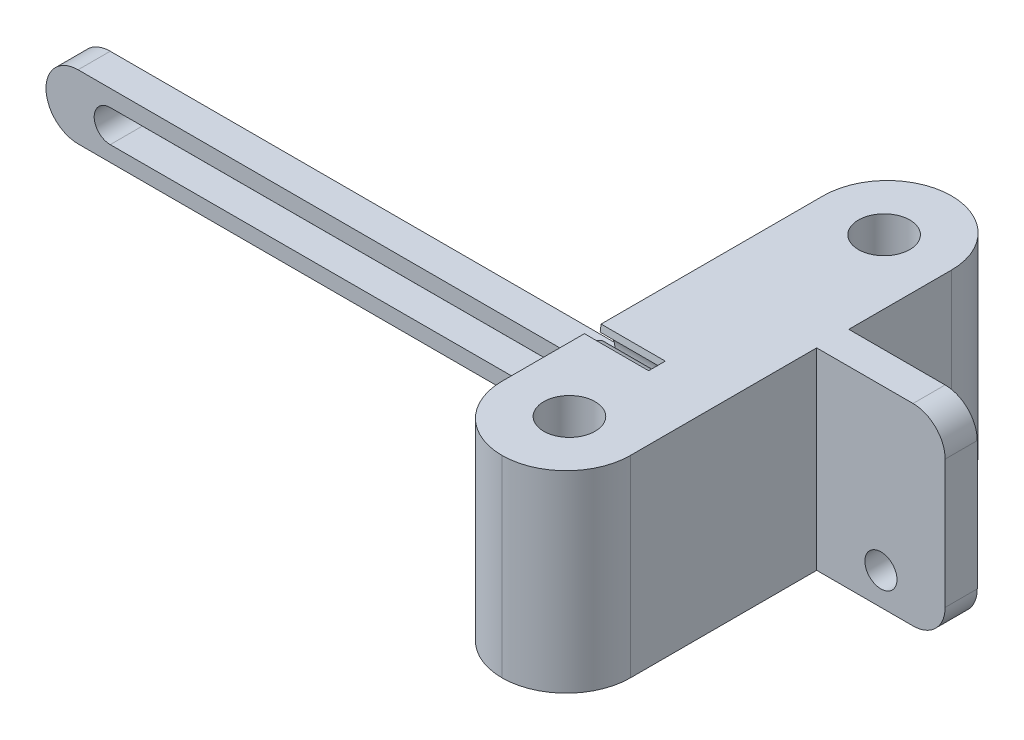
ISO-10303-21;
HEADER;
FILE_DESCRIPTION(('STEP AP214'),'2;1');
FILE_NAME('part.step','',(''),(''),'','','');
FILE_SCHEMA(('AUTOMOTIVE_DESIGN { 1 0 10303 214 1 1 1 1 }'));
ENDSEC;
DATA;
#1=APPLICATION_CONTEXT('core data for automotive mechanical design processes');
#2=APPLICATION_PROTOCOL_DEFINITION('international standard','automotive_design',2000,#1);
#3=PRODUCT_CONTEXT('',#1,'mechanical');
#4=PRODUCT('Part','Part','',(#3));
#5=PRODUCT_RELATED_PRODUCT_CATEGORY('part','',(#4));
#6=PRODUCT_DEFINITION_FORMATION('','',#4);
#7=PRODUCT_DEFINITION_CONTEXT('part definition',#1,'design');
#8=PRODUCT_DEFINITION('design','',#6,#7);
#9=PRODUCT_DEFINITION_SHAPE('','',#8);
#10=(LENGTH_UNIT() NAMED_UNIT(*) SI_UNIT(.MILLI.,.METRE.));
#11=(NAMED_UNIT(*) PLANE_ANGLE_UNIT() SI_UNIT($,.RADIAN.));
#12=(NAMED_UNIT(*) SI_UNIT($,.STERADIAN.) SOLID_ANGLE_UNIT());
#13=UNCERTAINTY_MEASURE_WITH_UNIT(LENGTH_MEASURE(1.E-05),#10,'distance_accuracy_value','');
#14=(GEOMETRIC_REPRESENTATION_CONTEXT(3) GLOBAL_UNCERTAINTY_ASSIGNED_CONTEXT((#13)) GLOBAL_UNIT_ASSIGNED_CONTEXT((#10,
#11,#12)) REPRESENTATION_CONTEXT('',''));
#15=CARTESIAN_POINT('',(0.,0.,0.));
#16=DIRECTION('',(0.,0.,1.));
#17=DIRECTION('',(1.,0.,0.));
#18=AXIS2_PLACEMENT_3D('',#15,#16,#17);
#19=CARTESIAN_POINT('',(0.,0.,0.));
#20=DIRECTION('',(0.,1.,0.));
#21=DIRECTION('',(0.,0.,1.));
#22=AXIS2_PLACEMENT_3D('',#19,#20,#21);
#23=PLANE('',#22);
#24=DIRECTION('',(-1.,0.,0.));
#25=VECTOR('',#24,1.);
#26=CARTESIAN_POINT('',(36.4776119402985,0.,-3.76119402985075));
#27=LINE('',#26,#25);
#28=CARTESIAN_POINT('',(31.4776119402985,0.,-3.76119402985075));
#29=VERTEX_POINT('',#28);
#30=CARTESIAN_POINT('',(-98.5223880597015,0.,-3.76119402985073));
#31=VERTEX_POINT('',#30);
#32=EDGE_CURVE('E326',#29,#31,#27,.T.);
#33=ORIENTED_EDGE('',*,*,#32,.F.);
#34=DIRECTION('',(0.,0.,1.));
#35=VECTOR('',#34,1.);
#36=CARTESIAN_POINT('',(31.4776119402985,0.,0.));
#37=LINE('',#36,#35);
#38=CARTESIAN_POINT('',(31.4776119402985,0.,1.23880597014925));
#39=VERTEX_POINT('',#38);
#40=EDGE_CURVE('E305',#29,#39,#37,.T.);
#41=ORIENTED_EDGE('',*,*,#40,.T.);
#42=DIRECTION('',(-1.,0.,0.));
#43=VECTOR('',#42,1.);
#44=CARTESIAN_POINT('',(36.4776119402985,0.,1.23880597014925));
#45=LINE('',#44,#43);
#46=CARTESIAN_POINT('',(16.4776119402985,0.,1.23880597014926));
#47=VERTEX_POINT('',#46);
#48=EDGE_CURVE('E325',#39,#47,#45,.T.);
#49=ORIENTED_EDGE('',*,*,#48,.T.);
#50=DIRECTION('',(0.,0.,-1.));
#51=VECTOR('',#50,1.);
#52=CARTESIAN_POINT('',(16.4776119402985,0.,-29.7611940298508));
#53=LINE('',#52,#51);
#54=CARTESIAN_POINT('',(16.4776119402985,0.,30.2388059701493));
#55=VERTEX_POINT('',#54);
#56=EDGE_CURVE('E241',#55,#47,#53,.T.);
#57=ORIENTED_EDGE('',*,*,#56,.F.);
#58=CARTESIAN_POINT('',(6.47761194029854,0.,30.2388059701493));
#59=DIRECTION('',(0.,1.,0.));
#60=DIRECTION('',(0.,0.,1.));
#61=AXIS2_PLACEMENT_3D('',#58,#59,#60);
#62=CIRCLE('',#61,10.);
#63=CARTESIAN_POINT('',(6.47761194029854,0.,40.2388059701493));
#64=VERTEX_POINT('',#63);
#65=EDGE_CURVE('E259',#55,#64,#62,.F.);
#66=ORIENTED_EDGE('',*,*,#65,.T.);
#67=CARTESIAN_POINT('',(6.47761194029854,0.,30.2388059701493));
#68=DIRECTION('',(0.,1.,0.));
#69=DIRECTION('',(0.,0.,1.));
#70=AXIS2_PLACEMENT_3D('',#67,#68,#69);
#71=CIRCLE('',#70,10.);
#72=CARTESIAN_POINT('',(-3.52238805970146,0.,30.2388059701493));
#73=VERTEX_POINT('',#72);
#74=EDGE_CURVE('E256',#64,#73,#71,.F.);
#75=ORIENTED_EDGE('',*,*,#74,.T.);
#76=DIRECTION('',(0.,0.,1.));
#77=VECTOR('',#76,1.);
#78=CARTESIAN_POINT('',(-3.52238805970147,0.,-29.7611940298508));
#79=LINE('',#78,#77);
#80=CARTESIAN_POINT('',(-3.52238805970147,0.,1.23880597014926));
#81=VERTEX_POINT('',#80);
#82=EDGE_CURVE('E246',#81,#73,#79,.T.);
#83=ORIENTED_EDGE('',*,*,#82,.F.);
#84=CARTESIAN_POINT('',(-98.5223880597015,0.,1.23880597014927));
#85=VERTEX_POINT('',#84);
#86=EDGE_CURVE('E318',#81,#85,#45,.T.);
#87=ORIENTED_EDGE('',*,*,#86,.T.);
#88=DIRECTION('',(0.,0.,1.));
#89=VECTOR('',#88,1.);
#90=CARTESIAN_POINT('',(-98.5223880597015,0.,-3.76119402985073));
#91=LINE('',#90,#89);
#92=EDGE_CURVE('E303',#85,#31,#91,.F.);
#93=ORIENTED_EDGE('',*,*,#92,.T.);
#94=EDGE_LOOP('',(#33,#41,#49,#57,#66,#75,#83,#87,#93));
#95=FACE_BOUND('',#94,.T.);
#96=ADVANCED_FACE('F33',(#95),#23,.F.);
#97=CARTESIAN_POINT('',(16.4776119402985,30.,-29.7611940298508));
#98=DIRECTION('',(-1.,0.,0.));
#99=DIRECTION('',(0.,0.,1.));
#100=AXIS2_PLACEMENT_3D('',#97,#98,#99);
#101=PLANE('',#100);
#102=DIRECTION('',(0.,-1.,0.));
#103=VECTOR('',#102,1.);
#104=CARTESIAN_POINT('',(16.4776119402985,30.,-3.76119402985075));
#105=LINE('',#104,#103);
#106=CARTESIAN_POINT('',(16.4776119402985,30.,-3.76119402985075));
#107=VERTEX_POINT('',#106);
#108=CARTESIAN_POINT('',(16.4776119402985,10.,-3.76119402985075));
#109=VERTEX_POINT('',#108);
#110=EDGE_CURVE('E285',#107,#109,#105,.T.);
#111=ORIENTED_EDGE('',*,*,#110,.T.);
#112=DIRECTION('',(0.,0.,1.));
#113=VECTOR('',#112,1.);
#114=CARTESIAN_POINT('',(16.4776119402985,10.,-3.76119402985075));
#115=LINE('',#114,#113);
#116=CARTESIAN_POINT('',(16.4776119402985,10.,-9.76119402985075));
#117=VERTEX_POINT('',#116);
#118=EDGE_CURVE('E226',#117,#109,#115,.T.);
#119=ORIENTED_EDGE('',*,*,#118,.F.);
#120=DIRECTION('',(0.,1.,0.));
#121=VECTOR('',#120,1.);
#122=CARTESIAN_POINT('',(16.4776119402985,10.,-9.76119402985075));
#123=LINE('',#122,#121);
#124=CARTESIAN_POINT('',(16.4776119402985,0.,-9.76119402985075));
#125=VERTEX_POINT('',#124);
#126=EDGE_CURVE('E217',#125,#117,#123,.T.);
#127=ORIENTED_EDGE('',*,*,#126,.F.);
#128=CARTESIAN_POINT('',(16.4776119402985,0.,-19.7611940298507));
#129=VERTEX_POINT('',#128);
#130=EDGE_CURVE('E232',#125,#129,#53,.T.);
#131=ORIENTED_EDGE('',*,*,#130,.T.);
#132=DIRECTION('',(0.,-1.,0.));
#133=VECTOR('',#132,1.);
#134=CARTESIAN_POINT('',(16.4776119402985,30.,-19.7611940298507));
#135=LINE('',#134,#133);
#136=CARTESIAN_POINT('',(16.4776119402985,30.,-19.7611940298507));
#137=VERTEX_POINT('',#136);
#138=EDGE_CURVE('E275',#129,#137,#135,.F.);
#139=ORIENTED_EDGE('',*,*,#138,.T.);
#140=DIRECTION('',(0.,0.,-1.));
#141=VECTOR('',#140,1.);
#142=CARTESIAN_POINT('',(16.4776119402985,30.,-29.7611940298508));
#143=LINE('',#142,#141);
#144=EDGE_CURVE('E401',#107,#137,#143,.T.);
#145=ORIENTED_EDGE('',*,*,#144,.F.);
#146=EDGE_LOOP('',(#111,#119,#127,#131,#139,#145));
#147=FACE_BOUND('',#146,.T.);
#148=ADVANCED_FACE('F230',(#147),#101,.F.);
#149=CARTESIAN_POINT('',(-3.52238805970147,30.,-29.7611940298508));
#150=DIRECTION('',(1.,0.,0.));
#151=DIRECTION('',(0.,0.,-1.));
#152=AXIS2_PLACEMENT_3D('',#149,#150,#151);
#153=PLANE('',#152);
#154=DIRECTION('',(0.,-1.,0.));
#155=VECTOR('',#154,1.);
#156=CARTESIAN_POINT('',(-3.52238805970147,10.,-9.76119402985075));
#157=LINE('',#156,#155);
#158=CARTESIAN_POINT('',(-3.52238805970147,10.,-9.76119402985075));
#159=VERTEX_POINT('',#158);
#160=CARTESIAN_POINT('',(-3.52238805970147,0.,-9.76119402985075));
#161=VERTEX_POINT('',#160);
#162=EDGE_CURVE('E220',#159,#161,#157,.T.);
#163=ORIENTED_EDGE('',*,*,#162,.F.);
#164=DIRECTION('',(0.,0.,-1.));
#165=VECTOR('',#164,1.);
#166=CARTESIAN_POINT('',(-3.52238805970147,10.,-3.76119402985077));
#167=LINE('',#166,#165);
#168=CARTESIAN_POINT('',(-3.52238805970147,10.,-3.76119402985075));
#169=VERTEX_POINT('',#168);
#170=EDGE_CURVE('E235',#169,#159,#167,.T.);
#171=ORIENTED_EDGE('',*,*,#170,.F.);
#172=DIRECTION('',(0.,0.,-1.));
#173=VECTOR('',#172,1.);
#174=CARTESIAN_POINT('',(-3.52238805970145,10.,1.23880597014925));
#175=LINE('',#174,#173);
#176=CARTESIAN_POINT('',(-3.52238805970145,10.,1.23880597014925));
#177=VERTEX_POINT('',#176);
#178=EDGE_CURVE('E499',#177,#169,#175,.T.);
#179=ORIENTED_EDGE('',*,*,#178,.F.);
#180=DIRECTION('',(0.,-1.,0.));
#181=VECTOR('',#180,1.);
#182=CARTESIAN_POINT('',(-3.52238805970146,30.,1.23880597014926));
#183=LINE('',#182,#181);
#184=CARTESIAN_POINT('',(-3.52238805970146,7.49509615086032,1.23880597014926));
#185=VERTEX_POINT('',#184);
#186=EDGE_CURVE('E352',#177,#185,#183,.T.);
#187=ORIENTED_EDGE('',*,*,#186,.T.);
#188=CARTESIAN_POINT('',(-3.52238805970148,2.49509374490727,1.23880597014925));
#189=VERTEX_POINT('',#188);
#190=EDGE_CURVE('E351',#185,#189,#183,.T.);
#191=ORIENTED_EDGE('',*,*,#190,.T.);
#192=EDGE_CURVE('E348',#189,#81,#183,.T.);
#193=ORIENTED_EDGE('',*,*,#192,.T.);
#194=ORIENTED_EDGE('',*,*,#82,.T.);
#195=DIRECTION('',(0.,-1.,0.));
#196=VECTOR('',#195,1.);
#197=CARTESIAN_POINT('',(-3.52238805970146,30.,30.2388059701493));
#198=LINE('',#197,#196);
#199=CARTESIAN_POINT('',(-3.52238805970146,30.,30.2388059701493));
#200=VERTEX_POINT('',#199);
#201=EDGE_CURVE('E250',#73,#200,#198,.F.);
#202=ORIENTED_EDGE('',*,*,#201,.T.);
#203=DIRECTION('',(0.,0.,1.));
#204=VECTOR('',#203,1.);
#205=CARTESIAN_POINT('',(-3.52238805970147,30.,-29.7611940298508));
#206=LINE('',#205,#204);
#207=CARTESIAN_POINT('',(-3.52238805970146,30.,17.4075983617578));
#208=VERTEX_POINT('',#207);
#209=EDGE_CURVE('E245',#208,#200,#206,.T.);
#210=ORIENTED_EDGE('',*,*,#209,.F.);
#211=DIRECTION('',(0.,-0.998274373174996,-0.0587220219514735));
#212=VECTOR('',#211,1.);
#213=CARTESIAN_POINT('',(-3.52238805970146,-0.916997145344465,15.5889514708551));
#214=LINE('',#213,#212);
#215=CARTESIAN_POINT('',(-3.52238805970146,28.9802150072761,17.3476110092446));
#216=VERTEX_POINT('',#215);
#217=EDGE_CURVE('E374',#208,#216,#214,.T.);
#218=ORIENTED_EDGE('',*,*,#217,.T.);
#219=CARTESIAN_POINT('',(-3.52238805970146,25.6865831727299,16.1635547021105));
#220=DIRECTION('',(-1.,0.,0.));
#221=DIRECTION('',(0.,0.,1.));
#222=AXIS2_PLACEMENT_3D('',#219,#220,#221);
#223=CIRCLE('',#222,3.5);
#224=CARTESIAN_POINT('',(-3.52238805970146,28.9694464253818,14.9499613334784));
#225=VERTEX_POINT('',#224);
#226=EDGE_CURVE('E371',#225,#216,#223,.T.);
#227=ORIENTED_EDGE('',*,*,#226,.F.);
#228=DIRECTION('',(0.,0.991227900682634,-0.132163720091024));
#229=VECTOR('',#228,1.);
#230=CARTESIAN_POINT('',(-3.52238805970146,2.46452674980748,18.4839506235552));
#231=LINE('',#230,#229);
#232=CARTESIAN_POINT('',(-3.52238805970146,30.,14.812554190196));
#233=VERTEX_POINT('',#232);
#234=EDGE_CURVE('E281',#225,#233,#231,.T.);
#235=ORIENTED_EDGE('',*,*,#234,.T.);
#236=CARTESIAN_POINT('',(-3.52238805970147,30.,-19.7611940298507));
#237=VERTEX_POINT('',#236);
#238=EDGE_CURVE('E400',#237,#233,#206,.T.);
#239=ORIENTED_EDGE('',*,*,#238,.F.);
#240=DIRECTION('',(0.,-1.,0.));
#241=VECTOR('',#240,1.);
#242=CARTESIAN_POINT('',(-3.52238805970147,30.,-19.7611940298507));
#243=LINE('',#242,#241);
#244=CARTESIAN_POINT('',(-3.52238805970147,0.,-19.7611940298507));
#245=VERTEX_POINT('',#244);
#246=EDGE_CURVE('E252',#237,#245,#243,.T.);
#247=ORIENTED_EDGE('',*,*,#246,.T.);
#248=EDGE_CURVE('E242',#245,#161,#79,.T.);
#249=ORIENTED_EDGE('',*,*,#248,.T.);
#250=EDGE_LOOP('',(#163,#171,#179,#187,#191,#193,#194,#202,#210,#218,#227,#235,#239,#247,#249));
#251=FACE_BOUND('',#250,.T.);
#252=ADVANCED_FACE('F422',(#251),#153,.F.);
#253=CARTESIAN_POINT('',(0.,30.,0.));
#254=DIRECTION('',(0.,1.,0.));
#255=DIRECTION('',(0.,0.,1.));
#256=AXIS2_PLACEMENT_3D('',#253,#254,#255);
#257=PLANE('',#256);
#258=DIRECTION('',(-1.,0.,0.));
#259=VECTOR('',#258,1.);
#260=CARTESIAN_POINT('',(36.4776119402985,30.,1.23880597014925));
#261=LINE('',#260,#259);
#262=CARTESIAN_POINT('',(31.4776119402985,30.,1.23880597014925));
#263=VERTEX_POINT('',#262);
#264=CARTESIAN_POINT('',(16.4776119402985,30.,1.23880597014925));
#265=VERTEX_POINT('',#264);
#266=EDGE_CURVE('E456',#263,#265,#261,.T.);
#267=ORIENTED_EDGE('',*,*,#266,.F.);
#268=DIRECTION('',(0.,0.,-1.));
#269=VECTOR('',#268,1.);
#270=CARTESIAN_POINT('',(31.4776119402985,30.,-3.76119402985075));
#271=LINE('',#270,#269);
#272=CARTESIAN_POINT('',(31.4776119402985,30.,-3.76119402985075));
#273=VERTEX_POINT('',#272);
#274=EDGE_CURVE('E287',#263,#273,#271,.T.);
#275=ORIENTED_EDGE('',*,*,#274,.T.);
#276=DIRECTION('',(-1.,0.,0.));
#277=VECTOR('',#276,1.);
#278=CARTESIAN_POINT('',(36.4776119402985,30.,-3.76119402985075));
#279=LINE('',#278,#277);
#280=EDGE_CURVE('E349',#273,#107,#279,.T.);
#281=ORIENTED_EDGE('',*,*,#280,.T.);
#282=ORIENTED_EDGE('',*,*,#144,.T.);
#283=CARTESIAN_POINT('',(6.47761194029853,30.,-19.7611940298507));
#284=DIRECTION('',(0.,1.,0.));
#285=DIRECTION('',(0.,0.,1.));
#286=AXIS2_PLACEMENT_3D('',#283,#284,#285);
#287=CIRCLE('',#286,10.);
#288=CARTESIAN_POINT('',(6.47761194029853,30.,-29.7611940298508));
#289=VERTEX_POINT('',#288);
#290=EDGE_CURVE('E268',#137,#289,#287,.T.);
#291=ORIENTED_EDGE('',*,*,#290,.T.);
#292=CARTESIAN_POINT('',(6.47761194029853,30.,-19.7611940298507));
#293=DIRECTION('',(0.,1.,0.));
#294=DIRECTION('',(0.,0.,1.));
#295=AXIS2_PLACEMENT_3D('',#292,#293,#294);
#296=CIRCLE('',#295,10.);
#297=EDGE_CURVE('E270',#289,#237,#296,.T.);
#298=ORIENTED_EDGE('',*,*,#297,.T.);
#299=ORIENTED_EDGE('',*,*,#238,.T.);
#300=DIRECTION('',(-1.,0.,0.));
#301=VECTOR('',#300,1.);
#302=CARTESIAN_POINT('',(6.47761194029853,30.,14.812554190196));
#303=LINE('',#302,#301);
#304=CARTESIAN_POINT('',(6.47761194029853,30.,14.812554190196));
#305=VERTEX_POINT('',#304);
#306=EDGE_CURVE('E379',#305,#233,#303,.T.);
#307=ORIENTED_EDGE('',*,*,#306,.F.);
#308=DIRECTION('',(0.,0.,-1.));
#309=VECTOR('',#308,1.);
#310=CARTESIAN_POINT('',(6.47761194029853,30.,0.));
#311=LINE('',#310,#309);
#312=CARTESIAN_POINT('',(6.47761194029853,30.,17.4075983617578));
#313=VERTEX_POINT('',#312);
#314=EDGE_CURVE('E362',#313,#305,#311,.T.);
#315=ORIENTED_EDGE('',*,*,#314,.F.);
#316=DIRECTION('',(-1.,0.,0.));
#317=VECTOR('',#316,1.);
#318=CARTESIAN_POINT('',(6.47761194029853,30.,17.4075983617578));
#319=LINE('',#318,#317);
#320=EDGE_CURVE('E383',#313,#208,#319,.T.);
#321=ORIENTED_EDGE('',*,*,#320,.T.);
#322=ORIENTED_EDGE('',*,*,#209,.T.);
#323=CARTESIAN_POINT('',(6.47761194029854,30.,30.2388059701493));
#324=DIRECTION('',(0.,1.,0.));
#325=DIRECTION('',(0.,0.,1.));
#326=AXIS2_PLACEMENT_3D('',#323,#324,#325);
#327=CIRCLE('',#326,10.);
#328=CARTESIAN_POINT('',(6.47761194029854,30.,40.2388059701493));
#329=VERTEX_POINT('',#328);
#330=EDGE_CURVE('E264',#200,#329,#327,.T.);
#331=ORIENTED_EDGE('',*,*,#330,.T.);
#332=CARTESIAN_POINT('',(6.47761194029854,30.,30.2388059701493));
#333=DIRECTION('',(0.,1.,0.));
#334=DIRECTION('',(0.,0.,1.));
#335=AXIS2_PLACEMENT_3D('',#332,#333,#334);
#336=CIRCLE('',#335,10.);
#337=CARTESIAN_POINT('',(16.4776119402985,30.,30.2388059701493));
#338=VERTEX_POINT('',#337);
#339=EDGE_CURVE('E266',#329,#338,#336,.T.);
#340=ORIENTED_EDGE('',*,*,#339,.T.);
#341=EDGE_CURVE('E253',#338,#265,#143,.T.);
#342=ORIENTED_EDGE('',*,*,#341,.T.);
#343=EDGE_LOOP('',(#267,#275,#281,#282,#291,#298,#299,#307,#315,#321,#322,#331,#340,#342));
#344=FACE_BOUND('',#343,.T.);
#345=CARTESIAN_POINT('',(6.47761194029853,30.,29.7388059701493));
#346=DIRECTION('',(0.,1.,0.));
#347=DIRECTION('',(0.,0.,1.));
#348=AXIS2_PLACEMENT_3D('',#345,#346,#347);
#349=CIRCLE('',#348,4.);
#350=CARTESIAN_POINT('',(6.47761194029853,30.,33.7388059701493));
#351=VERTEX_POINT('',#350);
#352=EDGE_CURVE('E382',#351,#351,#349,.T.);
#353=ORIENTED_EDGE('',*,*,#352,.F.);
#354=EDGE_LOOP('',(#353));
#355=FACE_BOUND('',#354,.T.);
#356=CARTESIAN_POINT('',(6.47761194029853,30.,-19.2611940298507));
#357=DIRECTION('',(0.,1.,0.));
#358=DIRECTION('',(0.,0.,1.));
#359=AXIS2_PLACEMENT_3D('',#356,#357,#358);
#360=CIRCLE('',#359,4.);
#361=CARTESIAN_POINT('',(6.47761194029853,30.,-15.2611940298507));
#362=VERTEX_POINT('',#361);
#363=EDGE_CURVE('E392',#362,#362,#360,.T.);
#364=ORIENTED_EDGE('',*,*,#363,.F.);
#365=EDGE_LOOP('',(#364));
#366=FACE_BOUND('',#365,.T.);
#367=ADVANCED_FACE('F407',(#344,#355,#366),#257,.T.);
#368=ORIENTED_EDGE('',*,*,#56,.T.);
#369=DIRECTION('',(0.,1.,0.));
#370=VECTOR('',#369,1.);
#371=CARTESIAN_POINT('',(16.4776119402985,30.,1.23880597014925));
#372=LINE('',#371,#370);
#373=EDGE_CURVE('E345',#47,#265,#372,.T.);
#374=ORIENTED_EDGE('',*,*,#373,.T.);
#375=ORIENTED_EDGE('',*,*,#341,.F.);
#376=DIRECTION('',(0.,-1.,0.));
#377=VECTOR('',#376,1.);
#378=CARTESIAN_POINT('',(16.4776119402985,30.,30.2388059701493));
#379=LINE('',#378,#377);
#380=EDGE_CURVE('E272',#338,#55,#379,.T.);
#381=ORIENTED_EDGE('',*,*,#380,.T.);
#382=EDGE_LOOP('',(#368,#374,#375,#381));
#383=FACE_BOUND('',#382,.T.);
#384=ADVANCED_FACE('F450',(#383),#101,.F.);
#385=ORIENTED_EDGE('',*,*,#130,.F.);
#386=DIRECTION('',(1.,0.,0.));
#387=VECTOR('',#386,1.);
#388=CARTESIAN_POINT('',(-103.523388059701,0.,-9.76119402985075));
#389=LINE('',#388,#387);
#390=EDGE_CURVE('E214',#161,#125,#389,.T.);
#391=ORIENTED_EDGE('',*,*,#390,.F.);
#392=ORIENTED_EDGE('',*,*,#248,.F.);
#393=CARTESIAN_POINT('',(6.47761194029853,0.,-19.7611940298507));
#394=DIRECTION('',(0.,1.,0.));
#395=DIRECTION('',(0.,0.,1.));
#396=AXIS2_PLACEMENT_3D('',#393,#394,#395);
#397=CIRCLE('',#396,10.);
#398=CARTESIAN_POINT('',(6.47761194029853,0.,-29.7611940298508));
#399=VERTEX_POINT('',#398);
#400=EDGE_CURVE('E262',#245,#399,#397,.F.);
#401=ORIENTED_EDGE('',*,*,#400,.T.);
#402=CARTESIAN_POINT('',(6.47761194029853,0.,-19.7611940298507));
#403=DIRECTION('',(0.,1.,0.));
#404=DIRECTION('',(0.,0.,1.));
#405=AXIS2_PLACEMENT_3D('',#402,#403,#404);
#406=CIRCLE('',#405,10.);
#407=EDGE_CURVE('E239',#399,#129,#406,.F.);
#408=ORIENTED_EDGE('',*,*,#407,.T.);
#409=EDGE_LOOP('',(#385,#391,#392,#401,#408));
#410=FACE_BOUND('',#409,.T.);
#411=ADVANCED_FACE('F237',(#410),#23,.F.);
#412=CARTESIAN_POINT('',(6.47761194029853,10.,29.7388059701493));
#413=DIRECTION('',(0.,1.,0.));
#414=DIRECTION('',(0.,0.,1.));
#415=AXIS2_PLACEMENT_3D('',#412,#413,#414);
#416=CYLINDRICAL_SURFACE('',#415,4.);
#417=CARTESIAN_POINT('',(6.47761194029853,10.,29.7388059701493));
#418=DIRECTION('',(0.,1.,0.));
#419=DIRECTION('',(0.,0.,1.));
#420=AXIS2_PLACEMENT_3D('',#417,#418,#419);
#421=CIRCLE('',#420,4.);
#422=CARTESIAN_POINT('',(6.47761194029853,10.,33.7388059701493));
#423=VERTEX_POINT('',#422);
#424=EDGE_CURVE('E395',#423,#423,#421,.T.);
#425=ORIENTED_EDGE('',*,*,#424,.F.);
#426=EDGE_LOOP('',(#425));
#427=FACE_BOUND('',#426,.T.);
#428=ORIENTED_EDGE('',*,*,#352,.T.);
#429=EDGE_LOOP('',(#428));
#430=FACE_BOUND('',#429,.T.);
#431=ADVANCED_FACE('F555',(#427,#430),#416,.F.);
#432=CARTESIAN_POINT('',(6.47761194029853,10.,29.7388059701493));
#433=DIRECTION('',(0.,1.,0.));
#434=DIRECTION('',(0.,0.,1.));
#435=AXIS2_PLACEMENT_3D('',#432,#433,#434);
#436=PLANE('',#435);
#437=ORIENTED_EDGE('',*,*,#424,.T.);
#438=EDGE_LOOP('',(#437));
#439=FACE_BOUND('',#438,.T.);
#440=ADVANCED_FACE('F560',(#439),#436,.T.);
#441=CARTESIAN_POINT('',(6.47761194029853,10.,-19.2611940298507));
#442=DIRECTION('',(0.,1.,0.));
#443=DIRECTION('',(0.,0.,1.));
#444=AXIS2_PLACEMENT_3D('',#441,#442,#443);
#445=CYLINDRICAL_SURFACE('',#444,4.);
#446=CARTESIAN_POINT('',(6.47761194029853,10.,-19.2611940298507));
#447=DIRECTION('',(0.,1.,0.));
#448=DIRECTION('',(0.,0.,1.));
#449=AXIS2_PLACEMENT_3D('',#446,#447,#448);
#450=CIRCLE('',#449,4.);
#451=CARTESIAN_POINT('',(6.47761194029853,10.,-15.2611940298507));
#452=VERTEX_POINT('',#451);
#453=EDGE_CURVE('E389',#452,#452,#450,.T.);
#454=ORIENTED_EDGE('',*,*,#453,.F.);
#455=EDGE_LOOP('',(#454));
#456=FACE_BOUND('',#455,.T.);
#457=ORIENTED_EDGE('',*,*,#363,.T.);
#458=EDGE_LOOP('',(#457));
#459=FACE_BOUND('',#458,.T.);
#460=ADVANCED_FACE('F825',(#456,#459),#445,.F.);
#461=CARTESIAN_POINT('',(6.47761194029853,10.,-19.2611940298507));
#462=DIRECTION('',(0.,1.,0.));
#463=DIRECTION('',(0.,0.,1.));
#464=AXIS2_PLACEMENT_3D('',#461,#462,#463);
#465=PLANE('',#464);
#466=ORIENTED_EDGE('',*,*,#453,.T.);
#467=EDGE_LOOP('',(#466));
#468=FACE_BOUND('',#467,.T.);
#469=ADVANCED_FACE('F761',(#468),#465,.T.);
#470=CARTESIAN_POINT('',(6.47761194029853,2.46452674980748,18.4839506235552));
#471=DIRECTION('',(0.,0.132163720091024,0.991227900682634));
#472=DIRECTION('',(0.,-0.991227900682634,0.132163720091024));
#473=AXIS2_PLACEMENT_3D('',#470,#471,#472);
#474=PLANE('',#473);
#475=ORIENTED_EDGE('',*,*,#234,.F.);
#476=DIRECTION('',(-1.,0.,0.));
#477=VECTOR('',#476,1.);
#478=CARTESIAN_POINT('',(6.47761194029853,28.9694464253818,14.9499613334784));
#479=LINE('',#478,#477);
#480=CARTESIAN_POINT('',(6.47761194029853,28.9694464253818,14.9499613334784));
#481=VERTEX_POINT('',#480);
#482=EDGE_CURVE('E368',#481,#225,#479,.T.);
#483=ORIENTED_EDGE('',*,*,#482,.F.);
#484=DIRECTION('',(0.,0.991227900682634,-0.132163720091024));
#485=VECTOR('',#484,1.);
#486=CARTESIAN_POINT('',(6.47761194029853,2.46452674980748,18.4839506235552));
#487=LINE('',#486,#485);
#488=EDGE_CURVE('E354',#481,#305,#487,.T.);
#489=ORIENTED_EDGE('',*,*,#488,.T.);
#490=ORIENTED_EDGE('',*,*,#306,.T.);
#491=EDGE_LOOP('',(#475,#483,#489,#490));
#492=FACE_BOUND('',#491,.T.);
#493=ADVANCED_FACE('F426',(#492),#474,.T.);
#494=CARTESIAN_POINT('',(6.47761194029853,-0.916997145344465,15.5889514708551));
#495=DIRECTION('',(0.,0.0587220219514735,-0.998274373174996));
#496=DIRECTION('',(0.,0.998274373174996,0.0587220219514735));
#497=AXIS2_PLACEMENT_3D('',#494,#495,#496);
#498=PLANE('',#497);
#499=ORIENTED_EDGE('',*,*,#217,.F.);
#500=ORIENTED_EDGE('',*,*,#320,.F.);
#501=DIRECTION('',(0.,-0.998274373174996,-0.0587220219514735));
#502=VECTOR('',#501,1.);
#503=CARTESIAN_POINT('',(6.47761194029853,-0.916997145344465,15.5889514708551));
#504=LINE('',#503,#502);
#505=CARTESIAN_POINT('',(6.47761194029853,28.9802150072761,17.3476110092446));
#506=VERTEX_POINT('',#505);
#507=EDGE_CURVE('E360',#313,#506,#504,.T.);
#508=ORIENTED_EDGE('',*,*,#507,.T.);
#509=DIRECTION('',(-1.,0.,0.));
#510=VECTOR('',#509,1.);
#511=CARTESIAN_POINT('',(6.47761194029853,28.9802150072761,17.3476110092446));
#512=LINE('',#511,#510);
#513=EDGE_CURVE('E386',#506,#216,#512,.T.);
#514=ORIENTED_EDGE('',*,*,#513,.T.);
#515=EDGE_LOOP('',(#499,#500,#508,#514));
#516=FACE_BOUND('',#515,.T.);
#517=ADVANCED_FACE('F438',(#516),#498,.T.);
#518=CARTESIAN_POINT('',(6.47761194029853,25.6865831727299,16.1635547021105));
#519=DIRECTION('',(-1.,0.,0.));
#520=DIRECTION('',(0.,0.,1.));
#521=AXIS2_PLACEMENT_3D('',#518,#519,#520);
#522=CYLINDRICAL_SURFACE('',#521,3.5);
#523=ORIENTED_EDGE('',*,*,#226,.T.);
#524=ORIENTED_EDGE('',*,*,#513,.F.);
#525=CARTESIAN_POINT('',(6.47761194029853,25.6865831727299,16.1635547021105));
#526=DIRECTION('',(-1.,0.,0.));
#527=DIRECTION('',(0.,0.,1.));
#528=AXIS2_PLACEMENT_3D('',#525,#526,#527);
#529=CIRCLE('',#528,3.5);
#530=EDGE_CURVE('E356',#481,#506,#529,.T.);
#531=ORIENTED_EDGE('',*,*,#530,.F.);
#532=ORIENTED_EDGE('',*,*,#482,.T.);
#533=EDGE_LOOP('',(#523,#524,#531,#532));
#534=FACE_BOUND('',#533,.T.);
#535=ADVANCED_FACE('F770',(#534),#522,.F.);
#536=CARTESIAN_POINT('',(6.47761194029853,25.6865831727299,16.1635547021105));
#537=DIRECTION('',(-1.,0.,0.));
#538=DIRECTION('',(0.,0.,1.));
#539=AXIS2_PLACEMENT_3D('',#536,#537,#538);
#540=CYLINDRICAL_SURFACE('',#539,2.5);
#541=CARTESIAN_POINT('',(6.47761194029853,25.6865831727299,16.1635547021105));
#542=DIRECTION('',(-1.,0.,0.));
#543=DIRECTION('',(0.,0.,1.));
#544=AXIS2_PLACEMENT_3D('',#541,#542,#543);
#545=CIRCLE('',#544,2.5);
#546=CARTESIAN_POINT('',(6.47761194029853,25.6865831727299,18.6635547021105));
#547=VERTEX_POINT('',#546);
#548=EDGE_CURVE('E365',#547,#547,#545,.T.);
#549=ORIENTED_EDGE('',*,*,#548,.T.);
#550=EDGE_LOOP('',(#549));
#551=FACE_BOUND('',#550,.T.);
#552=CARTESIAN_POINT('',(-3.52238805970146,25.6865831727299,16.1635547021105));
#553=DIRECTION('',(-1.,0.,0.));
#554=DIRECTION('',(0.,0.,1.));
#555=AXIS2_PLACEMENT_3D('',#552,#553,#554);
#556=CIRCLE('',#555,2.5);
#557=CARTESIAN_POINT('',(-3.52238805970146,25.6865831727299,18.6635547021105));
#558=VERTEX_POINT('',#557);
#559=EDGE_CURVE('E357',#558,#558,#556,.T.);
#560=ORIENTED_EDGE('',*,*,#559,.F.);
#561=EDGE_LOOP('',(#560));
#562=FACE_BOUND('',#561,.T.);
#563=ADVANCED_FACE('F778',(#551,#562),#540,.T.);
#564=CARTESIAN_POINT('',(6.47761194029853,0.,0.));
#565=DIRECTION('',(-1.,0.,0.));
#566=DIRECTION('',(0.,0.,1.));
#567=AXIS2_PLACEMENT_3D('',#564,#565,#566);
#568=PLANE('',#567);
#569=ORIENTED_EDGE('',*,*,#488,.F.);
#570=ORIENTED_EDGE('',*,*,#530,.T.);
#571=ORIENTED_EDGE('',*,*,#507,.F.);
#572=ORIENTED_EDGE('',*,*,#314,.T.);
#573=EDGE_LOOP('',(#569,#570,#571,#572));
#574=FACE_BOUND('',#573,.T.);
#575=ORIENTED_EDGE('',*,*,#548,.F.);
#576=EDGE_LOOP('',(#575));
#577=FACE_BOUND('',#576,.T.);
#578=ADVANCED_FACE('F433',(#574,#577),#568,.T.);
#579=ORIENTED_EDGE('',*,*,#559,.T.);
#580=EDGE_LOOP('',(#579));
#581=FACE_BOUND('',#580,.T.);
#582=ADVANCED_FACE('F569',(#581),#153,.F.);
#583=CARTESIAN_POINT('',(6.47761194029853,30.,-19.7611940298507));
#584=DIRECTION('',(0.,-1.,0.));
#585=DIRECTION('',(0.,0.,-1.));
#586=AXIS2_PLACEMENT_3D('',#583,#584,#585);
#587=CYLINDRICAL_SURFACE('',#586,10.);
#588=DIRECTION('',(0.,-1.,0.));
#589=VECTOR('',#588,1.);
#590=CARTESIAN_POINT('',(6.47761194029853,30.,-29.7611940298508));
#591=LINE('',#590,#589);
#592=EDGE_CURVE('E278',#289,#399,#591,.T.);
#593=ORIENTED_EDGE('',*,*,#592,.F.);
#594=ORIENTED_EDGE('',*,*,#290,.F.);
#595=ORIENTED_EDGE('',*,*,#138,.F.);
#596=ORIENTED_EDGE('',*,*,#407,.F.);
#597=EDGE_LOOP('',(#593,#594,#595,#596));
#598=FACE_BOUND('',#597,.T.);
#599=ADVANCED_FACE('F414',(#598),#587,.T.);
#600=CARTESIAN_POINT('',(6.47761194029853,30.,-19.7611940298507));
#601=DIRECTION('',(0.,-1.,0.));
#602=DIRECTION('',(0.,0.,-1.));
#603=AXIS2_PLACEMENT_3D('',#600,#601,#602);
#604=CYLINDRICAL_SURFACE('',#603,10.);
#605=ORIENTED_EDGE('',*,*,#297,.F.);
#606=ORIENTED_EDGE('',*,*,#592,.T.);
#607=ORIENTED_EDGE('',*,*,#400,.F.);
#608=ORIENTED_EDGE('',*,*,#246,.F.);
#609=EDGE_LOOP('',(#605,#606,#607,#608));
#610=FACE_BOUND('',#609,.T.);
#611=ADVANCED_FACE('F418',(#610),#604,.T.);
#612=CARTESIAN_POINT('',(6.47761194029854,30.,30.2388059701493));
#613=DIRECTION('',(0.,-1.,0.));
#614=DIRECTION('',(0.,0.,-1.));
#615=AXIS2_PLACEMENT_3D('',#612,#613,#614);
#616=CYLINDRICAL_SURFACE('',#615,10.);
#617=DIRECTION('',(0.,-1.,0.));
#618=VECTOR('',#617,1.);
#619=CARTESIAN_POINT('',(6.47761194029854,30.,40.2388059701493));
#620=LINE('',#619,#618);
#621=EDGE_CURVE('E282',#329,#64,#620,.T.);
#622=ORIENTED_EDGE('',*,*,#621,.F.);
#623=ORIENTED_EDGE('',*,*,#330,.F.);
#624=ORIENTED_EDGE('',*,*,#201,.F.);
#625=ORIENTED_EDGE('',*,*,#74,.F.);
#626=EDGE_LOOP('',(#622,#623,#624,#625));
#627=FACE_BOUND('',#626,.T.);
#628=ADVANCED_FACE('F443',(#627),#616,.T.);
#629=CARTESIAN_POINT('',(6.47761194029854,30.,30.2388059701493));
#630=DIRECTION('',(0.,-1.,0.));
#631=DIRECTION('',(0.,0.,-1.));
#632=AXIS2_PLACEMENT_3D('',#629,#630,#631);
#633=CYLINDRICAL_SURFACE('',#632,10.);
#634=ORIENTED_EDGE('',*,*,#339,.F.);
#635=ORIENTED_EDGE('',*,*,#621,.T.);
#636=ORIENTED_EDGE('',*,*,#65,.F.);
#637=ORIENTED_EDGE('',*,*,#380,.F.);
#638=EDGE_LOOP('',(#634,#635,#636,#637));
#639=FACE_BOUND('',#638,.T.);
#640=ADVANCED_FACE('F448',(#639),#633,.T.);
#641=CARTESIAN_POINT('',(36.4776119402985,0.,0.));
#642=DIRECTION('',(-1.,0.,0.));
#643=DIRECTION('',(0.,0.,1.));
#644=AXIS2_PLACEMENT_3D('',#641,#642,#643);
#645=PLANE('',#644);
#646=DIRECTION('',(0.,-1.,0.));
#647=VECTOR('',#646,1.);
#648=CARTESIAN_POINT('',(36.4776119402985,30.,-3.76119402985075));
#649=LINE('',#648,#647);
#650=CARTESIAN_POINT('',(36.4776119402985,25.,-3.76119402985075));
#651=VERTEX_POINT('',#650);
#652=CARTESIAN_POINT('',(36.4776119402985,5.,-3.76119402985075));
#653=VERTEX_POINT('',#652);
#654=EDGE_CURVE('E341',#651,#653,#649,.T.);
#655=ORIENTED_EDGE('',*,*,#654,.F.);
#656=DIRECTION('',(0.,0.,-1.));
#657=VECTOR('',#656,1.);
#658=CARTESIAN_POINT('',(36.4776119402985,25.,1.23880597014925));
#659=LINE('',#658,#657);
#660=CARTESIAN_POINT('',(36.4776119402985,25.,1.23880597014925));
#661=VERTEX_POINT('',#660);
#662=EDGE_CURVE('E297',#651,#661,#659,.F.);
#663=ORIENTED_EDGE('',*,*,#662,.T.);
#664=DIRECTION('',(0.,1.,0.));
#665=VECTOR('',#664,1.);
#666=CARTESIAN_POINT('',(36.4776119402985,30.,1.23880597014925));
#667=LINE('',#666,#665);
#668=CARTESIAN_POINT('',(36.4776119402985,5.,1.23880597014925));
#669=VERTEX_POINT('',#668);
#670=EDGE_CURVE('E338',#669,#661,#667,.T.);
#671=ORIENTED_EDGE('',*,*,#670,.F.);
#672=DIRECTION('',(0.,0.,1.));
#673=VECTOR('',#672,1.);
#674=CARTESIAN_POINT('',(36.4776119402985,5.,0.));
#675=LINE('',#674,#673);
#676=EDGE_CURVE('E295',#669,#653,#675,.F.);
#677=ORIENTED_EDGE('',*,*,#676,.T.);
#678=EDGE_LOOP('',(#655,#663,#671,#677));
#679=FACE_BOUND('',#678,.T.);
#680=ADVANCED_FACE('F529',(#679),#645,.F.);
#681=CARTESIAN_POINT('',(36.4776119402985,30.,1.23880597014925));
#682=DIRECTION('',(0.,0.,1.));
#683=DIRECTION('',(1.,0.,0.));
#684=AXIS2_PLACEMENT_3D('',#681,#682,#683);
#685=PLANE('',#684);
#686=CARTESIAN_POINT('',(26.4776119402985,5.,1.23880597014925));
#687=DIRECTION('',(0.,0.,-1.));
#688=DIRECTION('',(-1.,0.,0.));
#689=AXIS2_PLACEMENT_3D('',#686,#687,#688);
#690=CIRCLE('',#689,2.5);
#691=CARTESIAN_POINT('',(23.9776119402985,5.,1.23880597014925));
#692=VERTEX_POINT('',#691);
#693=EDGE_CURVE('E487',#692,#692,#690,.T.);
#694=ORIENTED_EDGE('',*,*,#693,.T.);
#695=EDGE_LOOP('',(#694));
#696=FACE_BOUND('',#695,.T.);
#697=ORIENTED_EDGE('',*,*,#670,.T.);
#698=CARTESIAN_POINT('',(31.4776119402985,25.,1.23880597014925));
#699=DIRECTION('',(0.,0.,1.));
#700=DIRECTION('',(1.,0.,0.));
#701=AXIS2_PLACEMENT_3D('',#698,#699,#700);
#702=CIRCLE('',#701,5.);
#703=EDGE_CURVE('E301',#661,#263,#702,.T.);
#704=ORIENTED_EDGE('',*,*,#703,.T.);
#705=ORIENTED_EDGE('',*,*,#266,.T.);
#706=ORIENTED_EDGE('',*,*,#373,.F.);
#707=ORIENTED_EDGE('',*,*,#48,.F.);
#708=CARTESIAN_POINT('',(31.4776119402985,5.,1.23880597014925));
#709=DIRECTION('',(0.,0.,1.));
#710=DIRECTION('',(1.,0.,0.));
#711=AXIS2_PLACEMENT_3D('',#708,#709,#710);
#712=CIRCLE('',#711,5.);
#713=EDGE_CURVE('E299',#39,#669,#712,.T.);
#714=ORIENTED_EDGE('',*,*,#713,.T.);
#715=EDGE_LOOP('',(#697,#704,#705,#706,#707,#714));
#716=FACE_BOUND('',#715,.T.);
#717=ADVANCED_FACE('F455',(#696,#716),#685,.T.);
#718=CARTESIAN_POINT('',(36.4776119402985,30.,-3.76119402985075));
#719=DIRECTION('',(0.,0.,-1.));
#720=DIRECTION('',(-1.,0.,0.));
#721=AXIS2_PLACEMENT_3D('',#718,#719,#720);
#722=PLANE('',#721);
#723=DIRECTION('',(-1.,0.,0.));
#724=VECTOR('',#723,1.);
#725=CARTESIAN_POINT('',(-3.52238805970145,10.,-3.76119402985075));
#726=LINE('',#725,#724);
#727=CARTESIAN_POINT('',(-98.5223880597015,10.,-3.76119402985073));
#728=VERTEX_POINT('',#727);
#729=EDGE_CURVE('E504',#169,#728,#726,.T.);
#730=ORIENTED_EDGE('',*,*,#729,.F.);
#731=DIRECTION('',(1.,0.,0.));
#732=VECTOR('',#731,1.);
#733=CARTESIAN_POINT('',(-103.523388059701,10.,-3.76119402985075));
#734=LINE('',#733,#732);
#735=EDGE_CURVE('E512',#169,#109,#734,.T.);
#736=ORIENTED_EDGE('',*,*,#735,.T.);
#737=ORIENTED_EDGE('',*,*,#110,.F.);
#738=ORIENTED_EDGE('',*,*,#280,.F.);
#739=CARTESIAN_POINT('',(31.4776119402985,25.,-3.76119402985075));
#740=DIRECTION('',(0.,0.,-1.));
#741=DIRECTION('',(-1.,0.,0.));
#742=AXIS2_PLACEMENT_3D('',#739,#740,#741);
#743=CIRCLE('',#742,5.);
#744=EDGE_CURVE('E293',#273,#651,#743,.T.);
#745=ORIENTED_EDGE('',*,*,#744,.T.);
#746=ORIENTED_EDGE('',*,*,#654,.T.);
#747=CARTESIAN_POINT('',(31.4776119402985,5.,-3.76119402985075));
#748=DIRECTION('',(0.,0.,-1.));
#749=DIRECTION('',(-1.,0.,0.));
#750=AXIS2_PLACEMENT_3D('',#747,#748,#749);
#751=CIRCLE('',#750,5.);
#752=EDGE_CURVE('E290',#653,#29,#751,.T.);
#753=ORIENTED_EDGE('',*,*,#752,.T.);
#754=ORIENTED_EDGE('',*,*,#32,.T.);
#755=CARTESIAN_POINT('',(-98.5223880597015,5.,-3.76119402985073));
#756=DIRECTION('',(0.,0.,-1.));
#757=DIRECTION('',(-1.,0.,0.));
#758=AXIS2_PLACEMENT_3D('',#755,#756,#757);
#759=CIRCLE('',#758,5.);
#760=CARTESIAN_POINT('',(-103.522388059701,5.,-3.76119402985073));
#761=VERTEX_POINT('',#760);
#762=EDGE_CURVE('E308',#31,#761,#759,.T.);
#763=ORIENTED_EDGE('',*,*,#762,.T.);
#764=CARTESIAN_POINT('',(-98.5223880597015,5.,-3.76119402985073));
#765=DIRECTION('',(0.,0.,-1.));
#766=DIRECTION('',(-1.,0.,0.));
#767=AXIS2_PLACEMENT_3D('',#764,#765,#766);
#768=CIRCLE('',#767,5.);
#769=EDGE_CURVE('E310',#761,#728,#768,.T.);
#770=ORIENTED_EDGE('',*,*,#769,.T.);
#771=EDGE_LOOP('',(#730,#736,#737,#738,#745,#746,#753,#754,#763,#770));
#772=FACE_BOUND('',#771,.T.);
#773=DIRECTION('',(0.999999518809622,0.00098100995118771,0.));
#774=VECTOR('',#773,1.);
#775=CARTESIAN_POINT('',(-93.5248405845794,7.40680280681621,-3.76119402985073));
#776=LINE('',#775,#774);
#777=CARTESIAN_POINT('',(-93.5248405845794,7.40680280681621,-3.76119402985073));
#778=VERTEX_POINT('',#777);
#779=CARTESIAN_POINT('',(1.47515941542057,7.49999879702405,-3.76119402985075));
#780=VERTEX_POINT('',#779);
#781=EDGE_CURVE('E481',#778,#780,#776,.T.);
#782=ORIENTED_EDGE('',*,*,#781,.F.);
#783=CARTESIAN_POINT('',(-93.5223880597015,4.90680400979215,-3.76119402985073));
#784=DIRECTION('',(0.,0.,-1.));
#785=DIRECTION('',(-1.,0.,0.));
#786=AXIS2_PLACEMENT_3D('',#783,#784,#785);
#787=CIRCLE('',#786,2.5);
#788=CARTESIAN_POINT('',(-93.5199355348235,2.4068052127681,-3.76119402985073));
#789=VERTEX_POINT('',#788);
#790=EDGE_CURVE('E484',#789,#778,#787,.T.);
#791=ORIENTED_EDGE('',*,*,#790,.F.);
#792=DIRECTION('',(-0.999999518809622,-0.000981009951187696,0.));
#793=VECTOR('',#792,1.);
#794=CARTESIAN_POINT('',(-93.5199355348235,2.4068052127681,-3.76119402985073));
#795=LINE('',#794,#793);
#796=CARTESIAN_POINT('',(1.48006446517651,2.50000120297594,-3.76119402985075));
#797=VERTEX_POINT('',#796);
#798=EDGE_CURVE('E475',#797,#789,#795,.T.);
#799=ORIENTED_EDGE('',*,*,#798,.F.);
#800=CARTESIAN_POINT('',(1.47761194029854,5.,-3.76119402985075));
#801=DIRECTION('',(0.,0.,-1.));
#802=DIRECTION('',(-1.,0.,0.));
#803=AXIS2_PLACEMENT_3D('',#800,#801,#802);
#804=CIRCLE('',#803,2.5);
#805=EDGE_CURVE('E478',#780,#797,#804,.T.);
#806=ORIENTED_EDGE('',*,*,#805,.F.);
#807=EDGE_LOOP('',(#782,#791,#799,#806));
#808=FACE_BOUND('',#807,.T.);
#809=CARTESIAN_POINT('',(26.4776119402985,5.,-3.76119402985075));
#810=DIRECTION('',(0.,0.,-1.));
#811=DIRECTION('',(-1.,0.,0.));
#812=AXIS2_PLACEMENT_3D('',#809,#810,#811);
#813=CIRCLE('',#812,2.5);
#814=CARTESIAN_POINT('',(23.9776119402985,5.,-3.76119402985075));
#815=VERTEX_POINT('',#814);
#816=EDGE_CURVE('E502',#815,#815,#813,.T.);
#817=ORIENTED_EDGE('',*,*,#816,.F.);
#818=EDGE_LOOP('',(#817));
#819=FACE_BOUND('',#818,.T.);
#820=ADVANCED_FACE('F332',(#772,#808,#819),#722,.T.);
#821=DIRECTION('',(-1.,0.,0.));
#822=VECTOR('',#821,1.);
#823=CARTESIAN_POINT('',(-3.52238805970145,10.,1.23880597014925));
#824=LINE('',#823,#822);
#825=CARTESIAN_POINT('',(-98.5223880597015,10.,1.23880597014927));
#826=VERTEX_POINT('',#825);
#827=EDGE_CURVE('E503',#177,#826,#824,.T.);
#828=ORIENTED_EDGE('',*,*,#827,.T.);
#829=CARTESIAN_POINT('',(-98.5223880597015,5.,1.23880597014927));
#830=DIRECTION('',(0.,0.,1.));
#831=DIRECTION('',(1.,0.,0.));
#832=AXIS2_PLACEMENT_3D('',#829,#830,#831);
#833=CIRCLE('',#832,5.);
#834=CARTESIAN_POINT('',(-103.522388059701,5.,1.23880597014927));
#835=VERTEX_POINT('',#834);
#836=EDGE_CURVE('E11',#826,#835,#833,.T.);
#837=ORIENTED_EDGE('',*,*,#836,.T.);
#838=CARTESIAN_POINT('',(-98.5223880597015,5.,1.23880597014927));
#839=DIRECTION('',(0.,0.,1.));
#840=DIRECTION('',(1.,0.,0.));
#841=AXIS2_PLACEMENT_3D('',#838,#839,#840);
#842=CIRCLE('',#841,5.);
#843=EDGE_CURVE('E42',#835,#85,#842,.T.);
#844=ORIENTED_EDGE('',*,*,#843,.T.);
#845=ORIENTED_EDGE('',*,*,#86,.F.);
#846=ORIENTED_EDGE('',*,*,#192,.F.);
#847=DIRECTION('',(0.999999518809622,0.000981009951187696,0.));
#848=VECTOR('',#847,1.);
#849=CARTESIAN_POINT('',(36.5045560188365,2.53436059425879,1.23880597014925));
#850=LINE('',#849,#848);
#851=CARTESIAN_POINT('',(-93.5199355348235,2.4068052127681,1.23880597014927));
#852=VERTEX_POINT('',#851);
#853=EDGE_CURVE('E277',#852,#189,#850,.T.);
#854=ORIENTED_EDGE('',*,*,#853,.F.);
#855=CARTESIAN_POINT('',(-93.5223880597015,4.90680400979215,1.23880597014927));
#856=DIRECTION('',(0.,0.,-1.));
#857=DIRECTION('',(-1.,0.,0.));
#858=AXIS2_PLACEMENT_3D('',#855,#856,#857);
#859=CIRCLE('',#858,2.5);
#860=CARTESIAN_POINT('',(-93.5248405845794,7.40680280681621,1.23880597014927));
#861=VERTEX_POINT('',#860);
#862=EDGE_CURVE('E477',#852,#861,#859,.T.);
#863=ORIENTED_EDGE('',*,*,#862,.T.);
#864=DIRECTION('',(0.999999518809622,0.00098100995118771,0.));
#865=VECTOR('',#864,1.);
#866=CARTESIAN_POINT('',(-93.5248405845794,7.40680280681621,1.23880597014927));
#867=LINE('',#866,#865);
#868=EDGE_CURVE('E493',#861,#185,#867,.T.);
#869=ORIENTED_EDGE('',*,*,#868,.T.);
#870=ORIENTED_EDGE('',*,*,#186,.F.);
#871=EDGE_LOOP('',(#828,#837,#844,#845,#846,#854,#863,#869,#870));
#872=FACE_BOUND('',#871,.T.);
#873=ADVANCED_FACE('F316',(#872),#685,.T.);
#874=CARTESIAN_POINT('',(-3.52238805970145,10.,1.23880597014925));
#875=DIRECTION('',(0.,-1.,0.));
#876=DIRECTION('',(0.,0.,-1.));
#877=AXIS2_PLACEMENT_3D('',#874,#875,#876);
#878=PLANE('',#877);
#879=ORIENTED_EDGE('',*,*,#729,.T.);
#880=DIRECTION('',(0.,0.,-1.));
#881=VECTOR('',#880,1.);
#882=CARTESIAN_POINT('',(-98.5223880597015,10.,1.23880597014927));
#883=LINE('',#882,#881);
#884=EDGE_CURVE('E312',#728,#826,#883,.F.);
#885=ORIENTED_EDGE('',*,*,#884,.T.);
#886=ORIENTED_EDGE('',*,*,#827,.F.);
#887=ORIENTED_EDGE('',*,*,#178,.T.);
#888=EDGE_LOOP('',(#879,#885,#886,#887));
#889=FACE_BOUND('',#888,.T.);
#890=ADVANCED_FACE('F523',(#889),#878,.F.);
#891=CARTESIAN_POINT('',(-93.5223880597015,4.90680400979215,1.23880597014927));
#892=DIRECTION('',(0.,0.,-1.));
#893=DIRECTION('',(-1.,0.,0.));
#894=AXIS2_PLACEMENT_3D('',#891,#892,#893);
#895=PLANE('',#894);
#896=ORIENTED_EDGE('',*,*,#190,.F.);
#897=CARTESIAN_POINT('',(1.47515941542057,7.49999879702405,1.23880597014925));
#898=VERTEX_POINT('',#897);
#899=EDGE_CURVE('E496',#185,#898,#867,.T.);
#900=ORIENTED_EDGE('',*,*,#899,.T.);
#901=CARTESIAN_POINT('',(1.47761194029854,5.,1.23880597014925));
#902=DIRECTION('',(0.,0.,-1.));
#903=DIRECTION('',(-1.,0.,0.));
#904=AXIS2_PLACEMENT_3D('',#901,#902,#903);
#905=CIRCLE('',#904,2.5);
#906=CARTESIAN_POINT('',(1.48006446517651,2.50000120297595,1.23880597014925));
#907=VERTEX_POINT('',#906);
#908=EDGE_CURVE('E490',#898,#907,#905,.T.);
#909=ORIENTED_EDGE('',*,*,#908,.T.);
#910=DIRECTION('',(-0.999999518809622,-0.000981009951187696,0.));
#911=VECTOR('',#910,1.);
#912=CARTESIAN_POINT('',(-93.5199355348235,2.4068052127681,1.23880597014927));
#913=LINE('',#912,#911);
#914=EDGE_CURVE('E467',#907,#189,#913,.T.);
#915=ORIENTED_EDGE('',*,*,#914,.T.);
#916=EDGE_LOOP('',(#896,#900,#909,#915));
#917=FACE_BOUND('',#916,.T.);
#918=ADVANCED_FACE('F615',(#917),#895,.T.);
#919=CARTESIAN_POINT('',(-93.5223880597015,4.90680400979215,1.23880597014927));
#920=DIRECTION('',(0.,0.,-1.));
#921=DIRECTION('',(-1.,0.,0.));
#922=AXIS2_PLACEMENT_3D('',#919,#920,#921);
#923=CYLINDRICAL_SURFACE('',#922,2.5);
#924=ORIENTED_EDGE('',*,*,#790,.T.);
#925=DIRECTION('',(0.,0.,-1.));
#926=VECTOR('',#925,1.);
#927=CARTESIAN_POINT('',(-93.5248405845794,7.40680280681621,1.23880597014927));
#928=LINE('',#927,#926);
#929=EDGE_CURVE('E463',#861,#778,#928,.T.);
#930=ORIENTED_EDGE('',*,*,#929,.F.);
#931=ORIENTED_EDGE('',*,*,#862,.F.);
#932=DIRECTION('',(0.,0.,-1.));
#933=VECTOR('',#932,1.);
#934=CARTESIAN_POINT('',(-93.5199355348235,2.4068052127681,1.23880597014927));
#935=LINE('',#934,#933);
#936=EDGE_CURVE('E462',#852,#789,#935,.T.);
#937=ORIENTED_EDGE('',*,*,#936,.T.);
#938=EDGE_LOOP('',(#924,#930,#931,#937));
#939=FACE_BOUND('',#938,.T.);
#940=ADVANCED_FACE('F623',(#939),#923,.F.);
#941=CARTESIAN_POINT('',(-93.5199355348235,2.4068052127681,1.23880597014927));
#942=DIRECTION('',(0.000981009951187696,-0.999999518809622,0.));
#943=DIRECTION('',(0.999999518809622,0.000981009951187696,0.));
#944=AXIS2_PLACEMENT_3D('',#941,#942,#943);
#945=PLANE('',#944);
#946=ORIENTED_EDGE('',*,*,#798,.T.);
#947=ORIENTED_EDGE('',*,*,#936,.F.);
#948=ORIENTED_EDGE('',*,*,#853,.T.);
#949=ORIENTED_EDGE('',*,*,#914,.F.);
#950=DIRECTION('',(0.,0.,-1.));
#951=VECTOR('',#950,1.);
#952=CARTESIAN_POINT('',(1.48006446517651,2.50000120297595,1.23880597014925));
#953=LINE('',#952,#951);
#954=EDGE_CURVE('E470',#907,#797,#953,.T.);
#955=ORIENTED_EDGE('',*,*,#954,.T.);
#956=EDGE_LOOP('',(#946,#947,#948,#949,#955));
#957=FACE_BOUND('',#956,.T.);
#958=ADVANCED_FACE('F631',(#957),#945,.F.);
#959=CARTESIAN_POINT('',(1.47761194029854,5.,1.23880597014925));
#960=DIRECTION('',(0.,0.,-1.));
#961=DIRECTION('',(-1.,0.,0.));
#962=AXIS2_PLACEMENT_3D('',#959,#960,#961);
#963=CYLINDRICAL_SURFACE('',#962,2.5);
#964=ORIENTED_EDGE('',*,*,#805,.T.);
#965=ORIENTED_EDGE('',*,*,#954,.F.);
#966=ORIENTED_EDGE('',*,*,#908,.F.);
#967=DIRECTION('',(0.,0.,-1.));
#968=VECTOR('',#967,1.);
#969=CARTESIAN_POINT('',(1.47515941542057,7.49999879702405,1.23880597014925));
#970=LINE('',#969,#968);
#971=EDGE_CURVE('E466',#898,#780,#970,.T.);
#972=ORIENTED_EDGE('',*,*,#971,.T.);
#973=EDGE_LOOP('',(#964,#965,#966,#972));
#974=FACE_BOUND('',#973,.T.);
#975=ADVANCED_FACE('F639',(#974),#963,.F.);
#976=CARTESIAN_POINT('',(-93.5248405845794,7.40680280681621,1.23880597014927));
#977=DIRECTION('',(-0.00098100995118771,0.999999518809622,0.));
#978=DIRECTION('',(-0.999999518809622,-0.00098100995118771,0.));
#979=AXIS2_PLACEMENT_3D('',#976,#977,#978);
#980=PLANE('',#979);
#981=ORIENTED_EDGE('',*,*,#929,.T.);
#982=ORIENTED_EDGE('',*,*,#781,.T.);
#983=ORIENTED_EDGE('',*,*,#971,.F.);
#984=ORIENTED_EDGE('',*,*,#899,.F.);
#985=ORIENTED_EDGE('',*,*,#868,.F.);
#986=EDGE_LOOP('',(#981,#982,#983,#984,#985));
#987=FACE_BOUND('',#986,.T.);
#988=ADVANCED_FACE('F543',(#987),#980,.F.);
#989=CARTESIAN_POINT('',(26.4776119402985,5.,1.23880597014925));
#990=DIRECTION('',(0.,0.,-1.));
#991=DIRECTION('',(-1.,0.,0.));
#992=AXIS2_PLACEMENT_3D('',#989,#990,#991);
#993=CYLINDRICAL_SURFACE('',#992,2.5);
#994=ORIENTED_EDGE('',*,*,#693,.F.);
#995=EDGE_LOOP('',(#994));
#996=FACE_BOUND('',#995,.T.);
#997=ORIENTED_EDGE('',*,*,#816,.T.);
#998=EDGE_LOOP('',(#997));
#999=FACE_BOUND('',#998,.T.);
#1000=ADVANCED_FACE('F535',(#996,#999),#993,.F.);
#1001=CARTESIAN_POINT('',(31.4776119402985,25.,0.));
#1002=DIRECTION('',(0.,0.,1.));
#1003=DIRECTION('',(1.,0.,0.));
#1004=AXIS2_PLACEMENT_3D('',#1001,#1002,#1003);
#1005=CYLINDRICAL_SURFACE('',#1004,5.);
#1006=ORIENTED_EDGE('',*,*,#703,.F.);
#1007=ORIENTED_EDGE('',*,*,#662,.F.);
#1008=ORIENTED_EDGE('',*,*,#744,.F.);
#1009=ORIENTED_EDGE('',*,*,#274,.F.);
#1010=EDGE_LOOP('',(#1006,#1007,#1008,#1009));
#1011=FACE_BOUND('',#1010,.T.);
#1012=ADVANCED_FACE('F532',(#1011),#1005,.T.);
#1013=CARTESIAN_POINT('',(31.4776119402985,5.,0.));
#1014=DIRECTION('',(0.,0.,1.));
#1015=DIRECTION('',(1.,0.,0.));
#1016=AXIS2_PLACEMENT_3D('',#1013,#1014,#1015);
#1017=CYLINDRICAL_SURFACE('',#1016,5.);
#1018=ORIENTED_EDGE('',*,*,#752,.F.);
#1019=ORIENTED_EDGE('',*,*,#676,.F.);
#1020=ORIENTED_EDGE('',*,*,#713,.F.);
#1021=ORIENTED_EDGE('',*,*,#40,.F.);
#1022=EDGE_LOOP('',(#1018,#1019,#1020,#1021));
#1023=FACE_BOUND('',#1022,.T.);
#1024=ADVANCED_FACE('F534',(#1023),#1017,.T.);
#1025=CARTESIAN_POINT('',(-98.5223880597015,5.,0.));
#1026=DIRECTION('',(0.,0.,-1.));
#1027=DIRECTION('',(-1.,0.,0.));
#1028=AXIS2_PLACEMENT_3D('',#1025,#1026,#1027);
#1029=CYLINDRICAL_SURFACE('',#1028,5.);
#1030=ORIENTED_EDGE('',*,*,#92,.F.);
#1031=ORIENTED_EDGE('',*,*,#843,.F.);
#1032=DIRECTION('',(0.,0.,1.));
#1033=VECTOR('',#1032,1.);
#1034=CARTESIAN_POINT('',(-103.522388059701,5.,1.23880597014927));
#1035=LINE('',#1034,#1033);
#1036=EDGE_CURVE('E37',#761,#835,#1035,.T.);
#1037=ORIENTED_EDGE('',*,*,#1036,.F.);
#1038=ORIENTED_EDGE('',*,*,#762,.F.);
#1039=EDGE_LOOP('',(#1030,#1031,#1037,#1038));
#1040=FACE_BOUND('',#1039,.T.);
#1041=ADVANCED_FACE('F35',(#1040),#1029,.T.);
#1042=CARTESIAN_POINT('',(-98.5223880597015,5.,0.));
#1043=DIRECTION('',(0.,0.,1.));
#1044=DIRECTION('',(0.,-1.,0.));
#1045=AXIS2_PLACEMENT_3D('',#1042,#1043,#1044);
#1046=CYLINDRICAL_SURFACE('',#1045,5.);
#1047=ORIENTED_EDGE('',*,*,#836,.F.);
#1048=ORIENTED_EDGE('',*,*,#884,.F.);
#1049=ORIENTED_EDGE('',*,*,#769,.F.);
#1050=ORIENTED_EDGE('',*,*,#1036,.T.);
#1051=EDGE_LOOP('',(#1047,#1048,#1049,#1050));
#1052=FACE_BOUND('',#1051,.T.);
#1053=ADVANCED_FACE('F687',(#1052),#1046,.T.);
#1054=CARTESIAN_POINT('',(-103.523388059701,10.,-3.76119402985075));
#1055=DIRECTION('',(0.,1.,0.));
#1056=DIRECTION('',(0.,0.,1.));
#1057=AXIS2_PLACEMENT_3D('',#1054,#1055,#1056);
#1058=PLANE('',#1057);
#1059=ORIENTED_EDGE('',*,*,#170,.T.);
#1060=DIRECTION('',(1.,0.,0.));
#1061=VECTOR('',#1060,1.);
#1062=CARTESIAN_POINT('',(-103.523388059701,10.,-9.76119402985075));
#1063=LINE('',#1062,#1061);
#1064=EDGE_CURVE('E225',#159,#117,#1063,.T.);
#1065=ORIENTED_EDGE('',*,*,#1064,.T.);
#1066=ORIENTED_EDGE('',*,*,#118,.T.);
#1067=ORIENTED_EDGE('',*,*,#735,.F.);
#1068=EDGE_LOOP('',(#1059,#1065,#1066,#1067));
#1069=FACE_BOUND('',#1068,.T.);
#1070=ADVANCED_FACE('F519',(#1069),#1058,.F.);
#1071=CARTESIAN_POINT('',(-103.523388059701,10.,-9.76119402985075));
#1072=DIRECTION('',(0.,0.,-1.));
#1073=DIRECTION('',(0.,1.,0.));
#1074=AXIS2_PLACEMENT_3D('',#1071,#1072,#1073);
#1075=PLANE('',#1074);
#1076=ORIENTED_EDGE('',*,*,#162,.T.);
#1077=ORIENTED_EDGE('',*,*,#390,.T.);
#1078=ORIENTED_EDGE('',*,*,#126,.T.);
#1079=ORIENTED_EDGE('',*,*,#1064,.F.);
#1080=EDGE_LOOP('',(#1076,#1077,#1078,#1079));
#1081=FACE_BOUND('',#1080,.T.);
#1082=ADVANCED_FACE('F216',(#1081),#1075,.F.);
#1083=CLOSED_SHELL('',(#96,#148,#252,#367,#384,#411,#431,#440,#460,#469,#493,#517,#535,#563,
#578,#582,#599,#611,#628,#640,#680,#717,#820,#873,#890,#918,#940,#958,#975,#988,#1000,#1012,
#1024,#1041,#1053,#1070,#1082));
#1084=MANIFOLD_SOLID_BREP('B2',#1083);
#1085=ADVANCED_BREP_SHAPE_REPRESENTATION('',(#18,#1084),#14);
#1086=SHAPE_DEFINITION_REPRESENTATION(#9,#1085);
ENDSEC;
END-ISO-10303-21;
